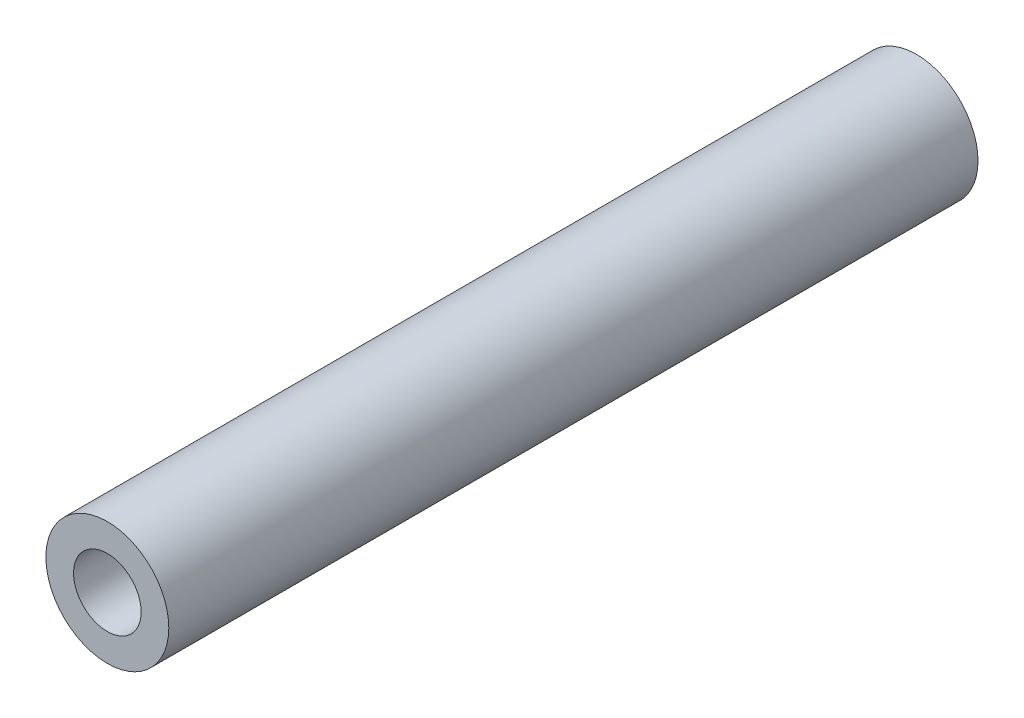
ISO-10303-21;
HEADER;
FILE_DESCRIPTION(('STEP AP214'),'2;1');
FILE_NAME('part.step','',(''),(''),'','','');
FILE_SCHEMA(('AUTOMOTIVE_DESIGN { 1 0 10303 214 1 1 1 1 }'));
ENDSEC;
DATA;
#1=APPLICATION_CONTEXT('core data for automotive mechanical design processes');
#2=APPLICATION_PROTOCOL_DEFINITION('international standard','automotive_design',2000,#1);
#3=PRODUCT_CONTEXT('',#1,'mechanical');
#4=PRODUCT('Part','Part','',(#3));
#5=PRODUCT_RELATED_PRODUCT_CATEGORY('part','',(#4));
#6=PRODUCT_DEFINITION_FORMATION('','',#4);
#7=PRODUCT_DEFINITION_CONTEXT('part definition',#1,'design');
#8=PRODUCT_DEFINITION('design','',#6,#7);
#9=PRODUCT_DEFINITION_SHAPE('','',#8);
#10=(LENGTH_UNIT() NAMED_UNIT(*) SI_UNIT(.MILLI.,.METRE.));
#11=(NAMED_UNIT(*) PLANE_ANGLE_UNIT() SI_UNIT($,.RADIAN.));
#12=(NAMED_UNIT(*) SI_UNIT($,.STERADIAN.) SOLID_ANGLE_UNIT());
#13=UNCERTAINTY_MEASURE_WITH_UNIT(LENGTH_MEASURE(1.E-05),#10,'distance_accuracy_value','');
#14=(GEOMETRIC_REPRESENTATION_CONTEXT(3) GLOBAL_UNCERTAINTY_ASSIGNED_CONTEXT((#13)) GLOBAL_UNIT_ASSIGNED_CONTEXT((#10,
#11,#12)) REPRESENTATION_CONTEXT('',''));
#15=CARTESIAN_POINT('',(0.,0.,0.));
#16=DIRECTION('',(0.,0.,1.));
#17=DIRECTION('',(1.,0.,0.));
#18=AXIS2_PLACEMENT_3D('',#15,#16,#17);
#19=CARTESIAN_POINT('',(0.,0.,39.5));
#20=DIRECTION('',(0.,0.,-1.));
#21=DIRECTION('',(-1.,0.,0.));
#22=AXIS2_PLACEMENT_3D('',#19,#20,#21);
#23=CYLINDRICAL_SURFACE('',#22,3.);
#24=CARTESIAN_POINT('',(0.,0.,39.5));
#25=DIRECTION('',(0.,0.,1.));
#26=DIRECTION('',(1.,0.,0.));
#27=AXIS2_PLACEMENT_3D('',#24,#25,#26);
#28=CIRCLE('',#27,3.);
#29=CARTESIAN_POINT('',(3.,0.,39.5));
#30=VERTEX_POINT('',#29);
#31=EDGE_CURVE('E10',#30,#30,#28,.T.);
#32=ORIENTED_EDGE('',*,*,#31,.F.);
#33=EDGE_LOOP('',(#32));
#34=FACE_BOUND('',#33,.T.);
#35=CARTESIAN_POINT('',(0.,0.,0.));
#36=DIRECTION('',(0.,0.,1.));
#37=DIRECTION('',(1.,0.,0.));
#38=AXIS2_PLACEMENT_3D('',#35,#36,#37);
#39=CIRCLE('',#38,3.);
#40=CARTESIAN_POINT('',(3.,0.,0.));
#41=VERTEX_POINT('',#40);
#42=EDGE_CURVE('E38',#41,#41,#39,.T.);
#43=ORIENTED_EDGE('',*,*,#42,.T.);
#44=EDGE_LOOP('',(#43));
#45=FACE_BOUND('',#44,.T.);
#46=ADVANCED_FACE('F35',(#34,#45),#23,.T.);
#47=CARTESIAN_POINT('',(0.,0.,39.5));
#48=DIRECTION('',(0.,0.,1.));
#49=DIRECTION('',(1.,0.,0.));
#50=AXIS2_PLACEMENT_3D('',#47,#48,#49);
#51=PLANE('',#50);
#52=CARTESIAN_POINT('',(0.,0.,39.5));
#53=DIRECTION('',(0.,0.,1.));
#54=DIRECTION('',(1.,0.,0.));
#55=AXIS2_PLACEMENT_3D('',#52,#53,#54);
#56=CIRCLE('',#55,1.65);
#57=CARTESIAN_POINT('',(1.65,0.,39.5));
#58=VERTEX_POINT('',#57);
#59=EDGE_CURVE('E49',#58,#58,#56,.T.);
#60=ORIENTED_EDGE('',*,*,#59,.F.);
#61=EDGE_LOOP('',(#60));
#62=FACE_BOUND('',#61,.T.);
#63=ORIENTED_EDGE('',*,*,#31,.T.);
#64=EDGE_LOOP('',(#63));
#65=FACE_BOUND('',#64,.T.);
#66=ADVANCED_FACE('F55',(#62,#65),#51,.T.);
#67=CARTESIAN_POINT('',(0.,0.,0.));
#68=DIRECTION('',(0.,0.,1.));
#69=DIRECTION('',(1.,0.,0.));
#70=AXIS2_PLACEMENT_3D('',#67,#68,#69);
#71=PLANE('',#70);
#72=CARTESIAN_POINT('',(0.,0.,0.));
#73=DIRECTION('',(0.,0.,1.));
#74=DIRECTION('',(1.,0.,0.));
#75=AXIS2_PLACEMENT_3D('',#72,#73,#74);
#76=CIRCLE('',#75,1.64999999999999);
#77=CARTESIAN_POINT('',(1.64999999999999,0.,0.));
#78=VERTEX_POINT('',#77);
#79=EDGE_CURVE('E45',#78,#78,#76,.T.);
#80=ORIENTED_EDGE('',*,*,#79,.T.);
#81=EDGE_LOOP('',(#80));
#82=FACE_BOUND('',#81,.T.);
#83=ORIENTED_EDGE('',*,*,#42,.F.);
#84=EDGE_LOOP('',(#83));
#85=FACE_BOUND('',#84,.T.);
#86=ADVANCED_FACE('F57',(#82,#85),#71,.F.);
#87=CARTESIAN_POINT('',(0.,0.,39.5));
#88=DIRECTION('',(0.,0.,1.));
#89=DIRECTION('',(1.,0.,0.));
#90=AXIS2_PLACEMENT_3D('',#87,#88,#89);
#91=CYLINDRICAL_SURFACE('',#90,1.64999999999999);
#92=ORIENTED_EDGE('',*,*,#79,.F.);
#93=EDGE_LOOP('',(#92));
#94=FACE_BOUND('',#93,.T.);
#95=ORIENTED_EDGE('',*,*,#59,.T.);
#96=EDGE_LOOP('',(#95));
#97=FACE_BOUND('',#96,.T.);
#98=ADVANCED_FACE('F53',(#94,#97),#91,.F.);
#99=CLOSED_SHELL('',(#46,#66,#86,#98));
#100=MANIFOLD_SOLID_BREP('B2',#99);
#101=ADVANCED_BREP_SHAPE_REPRESENTATION('',(#18,#100),#14);
#102=SHAPE_DEFINITION_REPRESENTATION(#9,#101);
ENDSEC;
END-ISO-10303-21;
